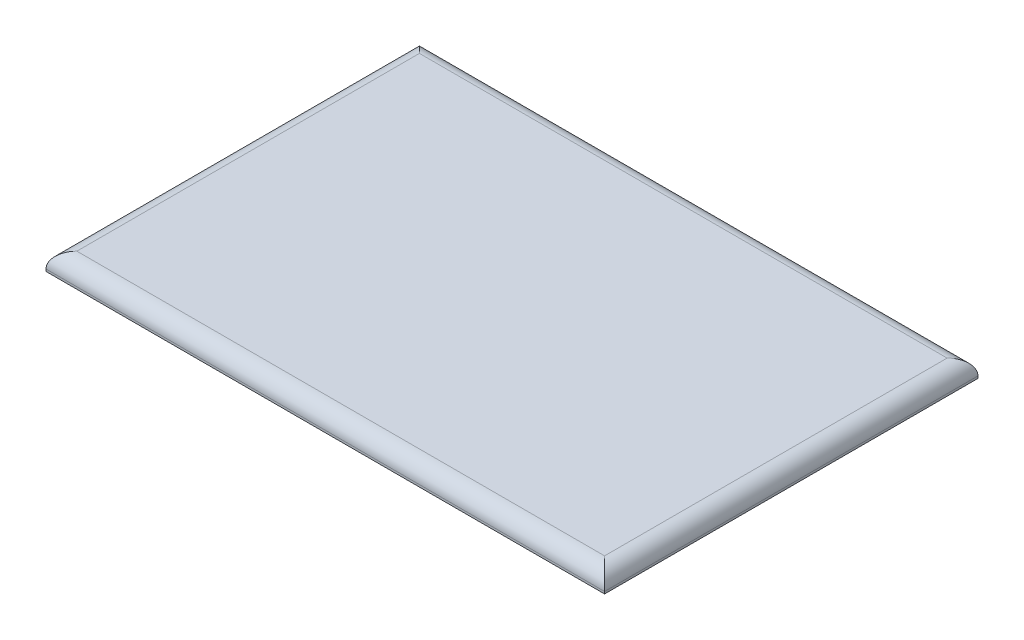
ISO-10303-21;
HEADER;
FILE_DESCRIPTION(('STEP AP214'),'2;1');
FILE_NAME('part.step','',(''),(''),'','','');
FILE_SCHEMA(('AUTOMOTIVE_DESIGN { 1 0 10303 214 1 1 1 1 }'));
ENDSEC;
DATA;
#1=APPLICATION_CONTEXT('core data for automotive mechanical design processes');
#2=APPLICATION_PROTOCOL_DEFINITION('international standard','automotive_design',2000,#1);
#3=PRODUCT_CONTEXT('',#1,'mechanical');
#4=PRODUCT('Part','Part','',(#3));
#5=PRODUCT_RELATED_PRODUCT_CATEGORY('part','',(#4));
#6=PRODUCT_DEFINITION_FORMATION('','',#4);
#7=PRODUCT_DEFINITION_CONTEXT('part definition',#1,'design');
#8=PRODUCT_DEFINITION('design','',#6,#7);
#9=PRODUCT_DEFINITION_SHAPE('','',#8);
#10=(LENGTH_UNIT() NAMED_UNIT(*) SI_UNIT(.MILLI.,.METRE.));
#11=(NAMED_UNIT(*) PLANE_ANGLE_UNIT() SI_UNIT($,.RADIAN.));
#12=(NAMED_UNIT(*) SI_UNIT($,.STERADIAN.) SOLID_ANGLE_UNIT());
#13=UNCERTAINTY_MEASURE_WITH_UNIT(LENGTH_MEASURE(1.E-05),#10,'distance_accuracy_value','');
#14=(GEOMETRIC_REPRESENTATION_CONTEXT(3) GLOBAL_UNCERTAINTY_ASSIGNED_CONTEXT((#13)) GLOBAL_UNIT_ASSIGNED_CONTEXT((#10,
#11,#12)) REPRESENTATION_CONTEXT('',''));
#15=CARTESIAN_POINT('',(0.,0.,0.));
#16=DIRECTION('',(0.,0.,1.));
#17=DIRECTION('',(1.,0.,0.));
#18=AXIS2_PLACEMENT_3D('',#15,#16,#17);
#19=CARTESIAN_POINT('',(0.,2.8956,0.));
#20=DIRECTION('',(1.,0.,0.));
#21=DIRECTION('',(0.,0.,-1.));
#22=AXIS2_PLACEMENT_3D('',#19,#20,#21);
#23=PLANE('',#22);
#24=DIRECTION('',(0.,-1.,0.));
#25=VECTOR('',#24,1.);
#26=CARTESIAN_POINT('',(0.,2.8956,0.));
#27=LINE('',#26,#25);
#28=CARTESIAN_POINT('',(0.,0.3556,0.));
#29=VERTEX_POINT('',#28);
#30=CARTESIAN_POINT('',(0.,0.,0.));
#31=VERTEX_POINT('',#30);
#32=EDGE_CURVE('E156',#29,#31,#27,.T.);
#33=ORIENTED_EDGE('',*,*,#32,.F.);
#34=DIRECTION('',(0.,0.,1.));
#35=VECTOR('',#34,1.);
#36=CARTESIAN_POINT('',(0.,0.3556,0.));
#37=LINE('',#36,#35);
#38=CARTESIAN_POINT('',(0.,0.3556,-61.468));
#39=VERTEX_POINT('',#38);
#40=EDGE_CURVE('E11',#29,#39,#37,.F.);
#41=ORIENTED_EDGE('',*,*,#40,.T.);
#42=DIRECTION('',(0.,-1.,0.));
#43=VECTOR('',#42,1.);
#44=CARTESIAN_POINT('',(0.,2.8956,-61.468));
#45=LINE('',#44,#43);
#46=CARTESIAN_POINT('',(0.,0.,-61.468));
#47=VERTEX_POINT('',#46);
#48=EDGE_CURVE('E163',#39,#47,#45,.T.);
#49=ORIENTED_EDGE('',*,*,#48,.T.);
#50=DIRECTION('',(0.,0.,1.));
#51=VECTOR('',#50,1.);
#52=CARTESIAN_POINT('',(0.,0.,0.));
#53=LINE('',#52,#51);
#54=CARTESIAN_POINT('',(0.,0.,-47.2948));
#55=VERTEX_POINT('',#54);
#56=EDGE_CURVE('E139',#47,#55,#53,.T.);
#57=ORIENTED_EDGE('',*,*,#56,.T.);
#58=DIRECTION('',(0.,1.,0.));
#59=VECTOR('',#58,1.);
#60=CARTESIAN_POINT('',(0.,-5.3848,-47.2948));
#61=LINE('',#60,#59);
#62=CARTESIAN_POINT('',(0.,-5.3848,-47.2948));
#63=VERTEX_POINT('',#62);
#64=EDGE_CURVE('E141',#63,#55,#61,.T.);
#65=ORIENTED_EDGE('',*,*,#64,.F.);
#66=DIRECTION('',(0.,0.,-1.));
#67=VECTOR('',#66,1.);
#68=CARTESIAN_POINT('',(0.,-5.3848,-47.2948));
#69=LINE('',#68,#67);
#70=CARTESIAN_POINT('',(0.,-5.3848,-14.1732));
#71=VERTEX_POINT('',#70);
#72=EDGE_CURVE('E122',#71,#63,#69,.T.);
#73=ORIENTED_EDGE('',*,*,#72,.F.);
#74=DIRECTION('',(0.,1.,0.));
#75=VECTOR('',#74,1.);
#76=CARTESIAN_POINT('',(0.,-5.3848,-14.1732));
#77=LINE('',#76,#75);
#78=CARTESIAN_POINT('',(0.,0.,-14.1732));
#79=VERTEX_POINT('',#78);
#80=EDGE_CURVE('E119',#71,#79,#77,.T.);
#81=ORIENTED_EDGE('',*,*,#80,.T.);
#82=EDGE_CURVE('E136',#79,#31,#53,.T.);
#83=ORIENTED_EDGE('',*,*,#82,.T.);
#84=EDGE_LOOP('',(#33,#41,#49,#57,#65,#73,#81,#83));
#85=FACE_BOUND('',#84,.T.);
#86=ADVANCED_FACE('F33',(#85),#23,.F.);
#87=CARTESIAN_POINT('',(0.,2.8956,0.));
#88=DIRECTION('',(0.,0.,-1.));
#89=DIRECTION('',(-1.,0.,0.));
#90=AXIS2_PLACEMENT_3D('',#87,#88,#89);
#91=PLANE('',#90);
#92=DIRECTION('',(0.,-1.,0.));
#93=VECTOR('',#92,1.);
#94=CARTESIAN_POINT('',(91.948,2.8956,0.));
#95=LINE('',#94,#93);
#96=CARTESIAN_POINT('',(91.948,0.3556,0.));
#97=VERTEX_POINT('',#96);
#98=CARTESIAN_POINT('',(91.948,0.,0.));
#99=VERTEX_POINT('',#98);
#100=EDGE_CURVE('E159',#97,#99,#95,.T.);
#101=ORIENTED_EDGE('',*,*,#100,.F.);
#102=DIRECTION('',(1.,0.,0.));
#103=VECTOR('',#102,1.);
#104=CARTESIAN_POINT('',(0.,0.3556,0.));
#105=LINE('',#104,#103);
#106=EDGE_CURVE('E42',#97,#29,#105,.F.);
#107=ORIENTED_EDGE('',*,*,#106,.T.);
#108=ORIENTED_EDGE('',*,*,#32,.T.);
#109=DIRECTION('',(1.,0.,0.));
#110=VECTOR('',#109,1.);
#111=CARTESIAN_POINT('',(0.,0.,0.));
#112=LINE('',#111,#110);
#113=EDGE_CURVE('E149',#31,#99,#112,.T.);
#114=ORIENTED_EDGE('',*,*,#113,.T.);
#115=EDGE_LOOP('',(#101,#107,#108,#114));
#116=FACE_BOUND('',#115,.T.);
#117=ADVANCED_FACE('F173',(#116),#91,.F.);
#118=CARTESIAN_POINT('',(91.948,2.8956,0.));
#119=DIRECTION('',(-1.,0.,0.));
#120=DIRECTION('',(0.,0.,1.));
#121=AXIS2_PLACEMENT_3D('',#118,#119,#120);
#122=PLANE('',#121);
#123=DIRECTION('',(0.,-1.,0.));
#124=VECTOR('',#123,1.);
#125=CARTESIAN_POINT('',(91.948,2.8956,-61.468));
#126=LINE('',#125,#124);
#127=CARTESIAN_POINT('',(91.948,0.3556,-61.468));
#128=VERTEX_POINT('',#127);
#129=CARTESIAN_POINT('',(91.948,0.,-61.468));
#130=VERTEX_POINT('',#129);
#131=EDGE_CURVE('E161',#128,#130,#126,.T.);
#132=ORIENTED_EDGE('',*,*,#131,.F.);
#133=DIRECTION('',(0.,0.,-1.));
#134=VECTOR('',#133,1.);
#135=CARTESIAN_POINT('',(91.948,0.3556,0.));
#136=LINE('',#135,#134);
#137=EDGE_CURVE('E57',#128,#97,#136,.F.);
#138=ORIENTED_EDGE('',*,*,#137,.T.);
#139=ORIENTED_EDGE('',*,*,#100,.T.);
#140=DIRECTION('',(0.,0.,-1.));
#141=VECTOR('',#140,1.);
#142=CARTESIAN_POINT('',(91.948,0.,0.));
#143=LINE('',#142,#141);
#144=EDGE_CURVE('E167',#99,#130,#143,.T.);
#145=ORIENTED_EDGE('',*,*,#144,.T.);
#146=EDGE_LOOP('',(#132,#138,#139,#145));
#147=FACE_BOUND('',#146,.T.);
#148=ADVANCED_FACE('F183',(#147),#122,.F.);
#149=CARTESIAN_POINT('',(0.,2.8956,-61.468));
#150=DIRECTION('',(0.,0.,1.));
#151=DIRECTION('',(1.,0.,0.));
#152=AXIS2_PLACEMENT_3D('',#149,#150,#151);
#153=PLANE('',#152);
#154=ORIENTED_EDGE('',*,*,#48,.F.);
#155=DIRECTION('',(-1.,0.,0.));
#156=VECTOR('',#155,1.);
#157=CARTESIAN_POINT('',(0.,0.3556,-61.468));
#158=LINE('',#157,#156);
#159=EDGE_CURVE('E182',#39,#128,#158,.F.);
#160=ORIENTED_EDGE('',*,*,#159,.T.);
#161=ORIENTED_EDGE('',*,*,#131,.T.);
#162=DIRECTION('',(-1.,0.,0.));
#163=VECTOR('',#162,1.);
#164=CARTESIAN_POINT('',(0.,0.,-61.468));
#165=LINE('',#164,#163);
#166=EDGE_CURVE('E165',#130,#47,#165,.T.);
#167=ORIENTED_EDGE('',*,*,#166,.T.);
#168=EDGE_LOOP('',(#154,#160,#161,#167));
#169=FACE_BOUND('',#168,.T.);
#170=ADVANCED_FACE('F179',(#169),#153,.F.);
#171=CARTESIAN_POINT('',(0.,2.8956,0.));
#172=DIRECTION('',(0.,-1.,0.));
#173=DIRECTION('',(0.,0.,-1.));
#174=AXIS2_PLACEMENT_3D('',#171,#172,#173);
#175=PLANE('',#174);
#176=DIRECTION('',(0.,0.,-1.));
#177=VECTOR('',#176,1.);
#178=CARTESIAN_POINT('',(89.408,2.8956,0.));
#179=LINE('',#178,#177);
#180=CARTESIAN_POINT('',(89.408,2.8956,-2.54));
#181=VERTEX_POINT('',#180);
#182=CARTESIAN_POINT('',(89.408,2.8956,-58.928));
#183=VERTEX_POINT('',#182);
#184=EDGE_CURVE('E217',#181,#183,#179,.T.);
#185=ORIENTED_EDGE('',*,*,#184,.T.);
#186=DIRECTION('',(-1.,0.,0.));
#187=VECTOR('',#186,1.);
#188=CARTESIAN_POINT('',(0.,2.8956,-58.928));
#189=LINE('',#188,#187);
#190=CARTESIAN_POINT('',(2.54,2.8956,-58.928));
#191=VERTEX_POINT('',#190);
#192=EDGE_CURVE('E234',#183,#191,#189,.T.);
#193=ORIENTED_EDGE('',*,*,#192,.T.);
#194=DIRECTION('',(0.,0.,1.));
#195=VECTOR('',#194,1.);
#196=CARTESIAN_POINT('',(2.54,2.8956,0.));
#197=LINE('',#196,#195);
#198=CARTESIAN_POINT('',(2.54,2.8956,-2.54));
#199=VERTEX_POINT('',#198);
#200=EDGE_CURVE('E158',#191,#199,#197,.T.);
#201=ORIENTED_EDGE('',*,*,#200,.T.);
#202=DIRECTION('',(1.,0.,0.));
#203=VECTOR('',#202,1.);
#204=CARTESIAN_POINT('',(0.,2.8956,-2.54));
#205=LINE('',#204,#203);
#206=EDGE_CURVE('E238',#199,#181,#205,.T.);
#207=ORIENTED_EDGE('',*,*,#206,.T.);
#208=EDGE_LOOP('',(#185,#193,#201,#207));
#209=FACE_BOUND('',#208,.T.);
#210=ADVANCED_FACE('F190',(#209),#175,.F.);
#211=CARTESIAN_POINT('',(0.,0.,0.));
#212=DIRECTION('',(0.,-1.,0.));
#213=DIRECTION('',(0.,0.,-1.));
#214=AXIS2_PLACEMENT_3D('',#211,#212,#213);
#215=PLANE('',#214);
#216=DIRECTION('',(1.,0.,0.));
#217=VECTOR('',#216,1.);
#218=CARTESIAN_POINT('',(33.1216,0.,-47.2948));
#219=LINE('',#218,#217);
#220=CARTESIAN_POINT('',(33.1216,0.,-47.2948));
#221=VERTEX_POINT('',#220);
#222=EDGE_CURVE('E132',#55,#221,#219,.T.);
#223=ORIENTED_EDGE('',*,*,#222,.F.);
#224=ORIENTED_EDGE('',*,*,#56,.F.);
#225=ORIENTED_EDGE('',*,*,#166,.F.);
#226=ORIENTED_EDGE('',*,*,#144,.F.);
#227=ORIENTED_EDGE('',*,*,#113,.F.);
#228=ORIENTED_EDGE('',*,*,#82,.F.);
#229=DIRECTION('',(-1.,0.,0.));
#230=VECTOR('',#229,1.);
#231=CARTESIAN_POINT('',(33.1216,0.,-14.1732));
#232=LINE('',#231,#230);
#233=CARTESIAN_POINT('',(33.1216,0.,-14.1732));
#234=VERTEX_POINT('',#233);
#235=EDGE_CURVE('E220',#234,#79,#232,.T.);
#236=ORIENTED_EDGE('',*,*,#235,.F.);
#237=DIRECTION('',(0.,0.,1.));
#238=VECTOR('',#237,1.);
#239=CARTESIAN_POINT('',(33.1216,0.,-47.2948));
#240=LINE('',#239,#238);
#241=EDGE_CURVE('E135',#221,#234,#240,.T.);
#242=ORIENTED_EDGE('',*,*,#241,.F.);
#243=EDGE_LOOP('',(#223,#224,#225,#226,#227,#228,#236,#242));
#244=FACE_BOUND('',#243,.T.);
#245=ADVANCED_FACE('F175',(#244),#215,.T.);
#246=CARTESIAN_POINT('',(33.1216,-5.3848,-47.2948));
#247=DIRECTION('',(-1.,0.,0.));
#248=DIRECTION('',(0.,0.,1.));
#249=AXIS2_PLACEMENT_3D('',#246,#247,#248);
#250=PLANE('',#249);
#251=ORIENTED_EDGE('',*,*,#241,.T.);
#252=DIRECTION('',(0.,1.,0.));
#253=VECTOR('',#252,1.);
#254=CARTESIAN_POINT('',(33.1216,-5.3848,-14.1732));
#255=LINE('',#254,#253);
#256=CARTESIAN_POINT('',(33.1216,-5.3848,-14.1732));
#257=VERTEX_POINT('',#256);
#258=EDGE_CURVE('E116',#257,#234,#255,.T.);
#259=ORIENTED_EDGE('',*,*,#258,.F.);
#260=DIRECTION('',(0.,0.,1.));
#261=VECTOR('',#260,1.);
#262=CARTESIAN_POINT('',(33.1216,-5.3848,-47.2948));
#263=LINE('',#262,#261);
#264=CARTESIAN_POINT('',(33.1216,-5.3848,-47.2948));
#265=VERTEX_POINT('',#264);
#266=EDGE_CURVE('E123',#265,#257,#263,.T.);
#267=ORIENTED_EDGE('',*,*,#266,.F.);
#268=DIRECTION('',(0.,1.,0.));
#269=VECTOR('',#268,1.);
#270=CARTESIAN_POINT('',(33.1216,-5.3848,-47.2948));
#271=LINE('',#270,#269);
#272=EDGE_CURVE('E145',#265,#221,#271,.T.);
#273=ORIENTED_EDGE('',*,*,#272,.T.);
#274=EDGE_LOOP('',(#251,#259,#267,#273));
#275=FACE_BOUND('',#274,.T.);
#276=ADVANCED_FACE('F134',(#275),#250,.F.);
#277=CARTESIAN_POINT('',(33.1216,-5.3848,-14.1732));
#278=DIRECTION('',(0.,0.,-1.));
#279=DIRECTION('',(-1.,0.,0.));
#280=AXIS2_PLACEMENT_3D('',#277,#278,#279);
#281=PLANE('',#280);
#282=ORIENTED_EDGE('',*,*,#235,.T.);
#283=ORIENTED_EDGE('',*,*,#80,.F.);
#284=DIRECTION('',(-1.,0.,0.));
#285=VECTOR('',#284,1.);
#286=CARTESIAN_POINT('',(33.1216,-5.3848,-14.1732));
#287=LINE('',#286,#285);
#288=EDGE_CURVE('E111',#257,#71,#287,.T.);
#289=ORIENTED_EDGE('',*,*,#288,.F.);
#290=ORIENTED_EDGE('',*,*,#258,.T.);
#291=EDGE_LOOP('',(#282,#283,#289,#290));
#292=FACE_BOUND('',#291,.T.);
#293=ADVANCED_FACE('F114',(#292),#281,.F.);
#294=CARTESIAN_POINT('',(33.1216,-5.3848,-47.2948));
#295=DIRECTION('',(0.,0.,1.));
#296=DIRECTION('',(1.,0.,0.));
#297=AXIS2_PLACEMENT_3D('',#294,#295,#296);
#298=PLANE('',#297);
#299=ORIENTED_EDGE('',*,*,#222,.T.);
#300=ORIENTED_EDGE('',*,*,#272,.F.);
#301=DIRECTION('',(1.,0.,0.));
#302=VECTOR('',#301,1.);
#303=CARTESIAN_POINT('',(33.1216,-5.3848,-47.2948));
#304=LINE('',#303,#302);
#305=EDGE_CURVE('E128',#63,#265,#304,.T.);
#306=ORIENTED_EDGE('',*,*,#305,.F.);
#307=ORIENTED_EDGE('',*,*,#64,.T.);
#308=EDGE_LOOP('',(#299,#300,#306,#307));
#309=FACE_BOUND('',#308,.T.);
#310=ADVANCED_FACE('F255',(#309),#298,.F.);
#311=CARTESIAN_POINT('',(0.,-5.3848,0.));
#312=DIRECTION('',(0.,-1.,0.));
#313=DIRECTION('',(0.,0.,-1.));
#314=AXIS2_PLACEMENT_3D('',#311,#312,#313);
#315=PLANE('',#314);
#316=ORIENTED_EDGE('',*,*,#266,.T.);
#317=ORIENTED_EDGE('',*,*,#288,.T.);
#318=ORIENTED_EDGE('',*,*,#72,.T.);
#319=ORIENTED_EDGE('',*,*,#305,.T.);
#320=EDGE_LOOP('',(#316,#317,#318,#319));
#321=FACE_BOUND('',#320,.T.);
#322=ADVANCED_FACE('F126',(#321),#315,.T.);
#323=CARTESIAN_POINT('',(0.,0.3556,-2.54));
#324=DIRECTION('',(1.,0.,0.));
#325=DIRECTION('',(0.,0.,-1.));
#326=AXIS2_PLACEMENT_3D('',#323,#324,#325);
#327=CYLINDRICAL_SURFACE('',#326,2.54);
#328=CARTESIAN_POINT('',(2.54,0.3556,-2.54));
#329=DIRECTION('',(0.707106781186547,0.,0.707106781186547));
#330=DIRECTION('',(-0.707106781186547,0.,0.707106781186547));
#331=AXIS2_PLACEMENT_3D('',#328,#329,#330);
#332=ELLIPSE('',#331,3.59210244842766,2.54);
#333=EDGE_CURVE('E219',#29,#199,#332,.F.);
#334=ORIENTED_EDGE('',*,*,#333,.F.);
#335=ORIENTED_EDGE('',*,*,#106,.F.);
#336=CARTESIAN_POINT('',(89.408,0.3556,-2.54));
#337=DIRECTION('',(0.707106781186547,0.,-0.707106781186547));
#338=DIRECTION('',(0.707106781186547,0.,0.707106781186547));
#339=AXIS2_PLACEMENT_3D('',#336,#337,#338);
#340=ELLIPSE('',#339,3.59210244842766,2.54);
#341=EDGE_CURVE('E37',#181,#97,#340,.T.);
#342=ORIENTED_EDGE('',*,*,#341,.F.);
#343=ORIENTED_EDGE('',*,*,#206,.F.);
#344=EDGE_LOOP('',(#334,#335,#342,#343));
#345=FACE_BOUND('',#344,.T.);
#346=ADVANCED_FACE('F35',(#345),#327,.T.);
#347=CARTESIAN_POINT('',(89.408,0.3556,0.));
#348=DIRECTION('',(0.,0.,-1.));
#349=DIRECTION('',(-1.,0.,0.));
#350=AXIS2_PLACEMENT_3D('',#347,#348,#349);
#351=CYLINDRICAL_SURFACE('',#350,2.54);
#352=ORIENTED_EDGE('',*,*,#341,.T.);
#353=ORIENTED_EDGE('',*,*,#137,.F.);
#354=CARTESIAN_POINT('',(89.408,0.3556,-58.928));
#355=DIRECTION('',(-0.707106781186547,0.,-0.707106781186547));
#356=DIRECTION('',(0.707106781186547,0.,-0.707106781186547));
#357=AXIS2_PLACEMENT_3D('',#354,#355,#356);
#358=ELLIPSE('',#357,3.59210244842766,2.54);
#359=EDGE_CURVE('E223',#183,#128,#358,.T.);
#360=ORIENTED_EDGE('',*,*,#359,.F.);
#361=ORIENTED_EDGE('',*,*,#184,.F.);
#362=EDGE_LOOP('',(#352,#353,#360,#361));
#363=FACE_BOUND('',#362,.T.);
#364=ADVANCED_FACE('F205',(#363),#351,.T.);
#365=CARTESIAN_POINT('',(2.54,0.3556,0.));
#366=DIRECTION('',(0.,0.,1.));
#367=DIRECTION('',(1.,0.,0.));
#368=AXIS2_PLACEMENT_3D('',#365,#366,#367);
#369=CYLINDRICAL_SURFACE('',#368,2.54);
#370=ORIENTED_EDGE('',*,*,#333,.T.);
#371=ORIENTED_EDGE('',*,*,#200,.F.);
#372=CARTESIAN_POINT('',(2.54,0.3556,-58.928));
#373=DIRECTION('',(-0.707106781186547,0.,0.707106781186547));
#374=DIRECTION('',(0.707106781186547,0.,0.707106781186547));
#375=AXIS2_PLACEMENT_3D('',#372,#373,#374);
#376=ELLIPSE('',#375,3.59210244842766,2.54);
#377=EDGE_CURVE('E227',#39,#191,#376,.F.);
#378=ORIENTED_EDGE('',*,*,#377,.F.);
#379=ORIENTED_EDGE('',*,*,#40,.F.);
#380=EDGE_LOOP('',(#370,#371,#378,#379));
#381=FACE_BOUND('',#380,.T.);
#382=ADVANCED_FACE('F202',(#381),#369,.T.);
#383=CARTESIAN_POINT('',(0.,0.3556,-58.928));
#384=DIRECTION('',(-1.,0.,0.));
#385=DIRECTION('',(0.,0.,1.));
#386=AXIS2_PLACEMENT_3D('',#383,#384,#385);
#387=CYLINDRICAL_SURFACE('',#386,2.54);
#388=ORIENTED_EDGE('',*,*,#359,.T.);
#389=ORIENTED_EDGE('',*,*,#159,.F.);
#390=ORIENTED_EDGE('',*,*,#377,.T.);
#391=ORIENTED_EDGE('',*,*,#192,.F.);
#392=EDGE_LOOP('',(#388,#389,#390,#391));
#393=FACE_BOUND('',#392,.T.);
#394=ADVANCED_FACE('F199',(#393),#387,.T.);
#395=CLOSED_SHELL('',(#86,#117,#148,#170,#210,#245,#276,#293,#310,#322,#346,#364,#382,#394));
#396=MANIFOLD_SOLID_BREP('B2',#395);
#397=ADVANCED_BREP_SHAPE_REPRESENTATION('',(#18,#396),#14);
#398=SHAPE_DEFINITION_REPRESENTATION(#9,#397);
ENDSEC;
END-ISO-10303-21;
